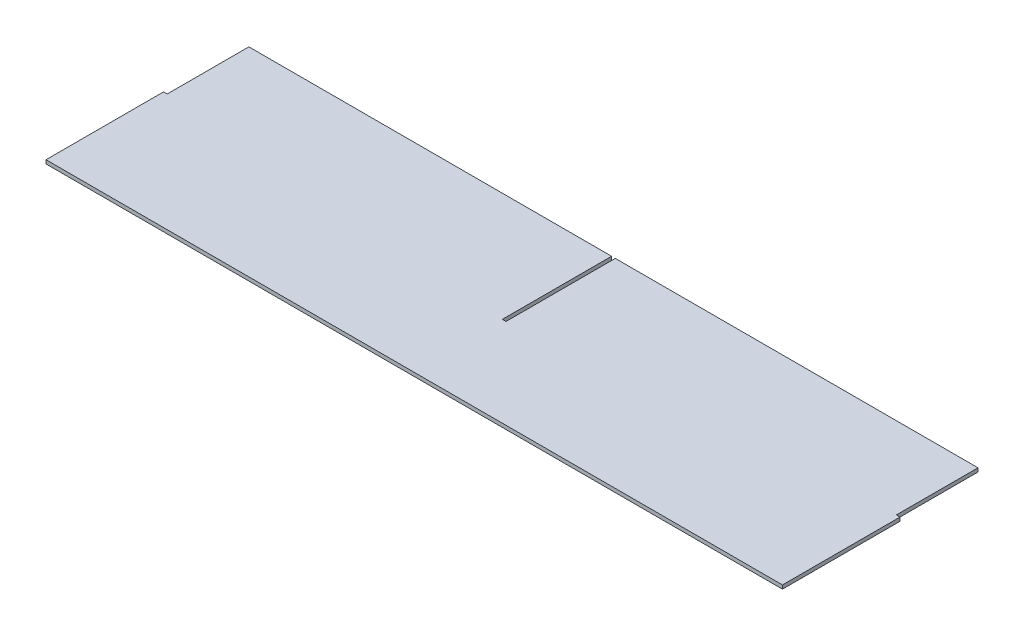
ISO-10303-21;
HEADER;
FILE_DESCRIPTION(('STEP AP214'),'2;1');
FILE_NAME('part.step','',(''),(''),'','','');
FILE_SCHEMA(('AUTOMOTIVE_DESIGN { 1 0 10303 214 1 1 1 1 }'));
ENDSEC;
DATA;
#1=APPLICATION_CONTEXT('core data for automotive mechanical design processes');
#2=APPLICATION_PROTOCOL_DEFINITION('international standard','automotive_design',2000,#1);
#3=PRODUCT_CONTEXT('',#1,'mechanical');
#4=PRODUCT('Part','Part','',(#3));
#5=PRODUCT_RELATED_PRODUCT_CATEGORY('part','',(#4));
#6=PRODUCT_DEFINITION_FORMATION('','',#4);
#7=PRODUCT_DEFINITION_CONTEXT('part definition',#1,'design');
#8=PRODUCT_DEFINITION('design','',#6,#7);
#9=PRODUCT_DEFINITION_SHAPE('','',#8);
#10=(LENGTH_UNIT() NAMED_UNIT(*) SI_UNIT(.MILLI.,.METRE.));
#11=(NAMED_UNIT(*) PLANE_ANGLE_UNIT() SI_UNIT($,.RADIAN.));
#12=(NAMED_UNIT(*) SI_UNIT($,.STERADIAN.) SOLID_ANGLE_UNIT());
#13=UNCERTAINTY_MEASURE_WITH_UNIT(LENGTH_MEASURE(1.E-05),#10,'distance_accuracy_value','');
#14=(GEOMETRIC_REPRESENTATION_CONTEXT(3) GLOBAL_UNCERTAINTY_ASSIGNED_CONTEXT((#13)) GLOBAL_UNIT_ASSIGNED_CONTEXT((#10,
#11,#12)) REPRESENTATION_CONTEXT('',''));
#15=CARTESIAN_POINT('',(0.,0.,0.));
#16=DIRECTION('',(0.,0.,1.));
#17=DIRECTION('',(1.,0.,0.));
#18=AXIS2_PLACEMENT_3D('',#15,#16,#17);
#19=CARTESIAN_POINT('',(0.,3.175,-172.09262));
#20=DIRECTION('',(0.,0.,-1.));
#21=DIRECTION('',(-1.,0.,0.));
#22=AXIS2_PLACEMENT_3D('',#19,#20,#21);
#23=PLANE('',#22);
#24=DIRECTION('',(1.,0.,0.));
#25=VECTOR('',#24,1.);
#26=CARTESIAN_POINT('',(0.,3.175,-172.09262));
#27=LINE('',#26,#25);
#28=CARTESIAN_POINT('',(319.717419999999,3.17500000000132,-172.09262));
#29=VERTEX_POINT('',#28);
#30=CARTESIAN_POINT('',(633.08484,3.175,-172.09262));
#31=VERTEX_POINT('',#30);
#32=EDGE_CURVE('E162',#29,#31,#27,.T.);
#33=ORIENTED_EDGE('',*,*,#32,.T.);
#34=DIRECTION('',(0.,-1.,0.));
#35=VECTOR('',#34,1.);
#36=CARTESIAN_POINT('',(633.08484,3.175,-172.09262));
#37=LINE('',#36,#35);
#38=CARTESIAN_POINT('',(633.08484,0.,-172.09262));
#39=VERTEX_POINT('',#38);
#40=EDGE_CURVE('E190',#31,#39,#37,.T.);
#41=ORIENTED_EDGE('',*,*,#40,.T.);
#42=DIRECTION('',(1.,0.,0.));
#43=VECTOR('',#42,1.);
#44=CARTESIAN_POINT('',(0.,0.,-172.09262));
#45=LINE('',#44,#43);
#46=CARTESIAN_POINT('',(319.717419999999,9.43689570931383E-13,-172.09262));
#47=VERTEX_POINT('',#46);
#48=EDGE_CURVE('E144',#47,#39,#45,.T.);
#49=ORIENTED_EDGE('',*,*,#48,.F.);
#50=DIRECTION('',(0.,-1.,0.));
#51=VECTOR('',#50,1.);
#52=CARTESIAN_POINT('',(319.717419999999,3.17500000000132,-172.09262));
#53=LINE('',#52,#51);
#54=EDGE_CURVE('E207',#29,#47,#53,.T.);
#55=ORIENTED_EDGE('',*,*,#54,.F.);
#56=EDGE_LOOP('',(#33,#41,#49,#55));
#57=FACE_BOUND('',#56,.T.);
#58=ADVANCED_FACE('F36',(#57),#23,.T.);
#59=CARTESIAN_POINT('',(636.25984,3.175,0.));
#60=DIRECTION('',(-1.,0.,0.));
#61=DIRECTION('',(0.,0.,1.));
#62=AXIS2_PLACEMENT_3D('',#59,#60,#61);
#63=PLANE('',#62);
#64=DIRECTION('',(0.,1.,0.));
#65=VECTOR('',#64,1.);
#66=CARTESIAN_POINT('',(636.25984,3.175,-101.6));
#67=LINE('',#66,#65);
#68=CARTESIAN_POINT('',(636.25984,0.,-101.6));
#69=VERTEX_POINT('',#68);
#70=CARTESIAN_POINT('',(636.25984,3.175,-101.6));
#71=VERTEX_POINT('',#70);
#72=EDGE_CURVE('E59',#69,#71,#67,.T.);
#73=ORIENTED_EDGE('',*,*,#72,.T.);
#74=DIRECTION('',(0.,0.,-1.));
#75=VECTOR('',#74,1.);
#76=CARTESIAN_POINT('',(636.25984,3.175,0.));
#77=LINE('',#76,#75);
#78=CARTESIAN_POINT('',(636.25984,3.175,0.));
#79=VERTEX_POINT('',#78);
#80=EDGE_CURVE('E170',#79,#71,#77,.T.);
#81=ORIENTED_EDGE('',*,*,#80,.F.);
#82=DIRECTION('',(0.,-1.,0.));
#83=VECTOR('',#82,1.);
#84=CARTESIAN_POINT('',(636.25984,3.175,0.));
#85=LINE('',#84,#83);
#86=CARTESIAN_POINT('',(636.25984,0.,0.));
#87=VERTEX_POINT('',#86);
#88=EDGE_CURVE('E40',#79,#87,#85,.T.);
#89=ORIENTED_EDGE('',*,*,#88,.T.);
#90=DIRECTION('',(0.,0.,-1.));
#91=VECTOR('',#90,1.);
#92=CARTESIAN_POINT('',(636.25984,0.,0.));
#93=LINE('',#92,#91);
#94=EDGE_CURVE('E156',#87,#69,#93,.T.);
#95=ORIENTED_EDGE('',*,*,#94,.T.);
#96=EDGE_LOOP('',(#73,#81,#89,#95));
#97=FACE_BOUND('',#96,.T.);
#98=ADVANCED_FACE('F177',(#97),#63,.F.);
#99=CARTESIAN_POINT('',(3.175,0.,-172.09262));
#100=VERTEX_POINT('',#99);
#101=CARTESIAN_POINT('',(316.542419999999,9.43689570931383E-13,-172.09262));
#102=VERTEX_POINT('',#101);
#103=EDGE_CURVE('E148',#100,#102,#45,.T.);
#104=ORIENTED_EDGE('',*,*,#103,.F.);
#105=DIRECTION('',(0.,1.,0.));
#106=VECTOR('',#105,1.);
#107=CARTESIAN_POINT('',(3.175,3.175,-172.09262));
#108=LINE('',#107,#106);
#109=CARTESIAN_POINT('',(3.175,3.175,-172.09262));
#110=VERTEX_POINT('',#109);
#111=EDGE_CURVE('E138',#100,#110,#108,.T.);
#112=ORIENTED_EDGE('',*,*,#111,.T.);
#113=CARTESIAN_POINT('',(316.542419999999,3.17500000000237,-172.09262));
#114=VERTEX_POINT('',#113);
#115=EDGE_CURVE('E165',#110,#114,#27,.T.);
#116=ORIENTED_EDGE('',*,*,#115,.T.);
#117=DIRECTION('',(0.,1.,0.));
#118=VECTOR('',#117,1.);
#119=CARTESIAN_POINT('',(316.542419999999,3.17500000000237,-172.09262));
#120=LINE('',#119,#118);
#121=EDGE_CURVE('E198',#102,#114,#120,.T.);
#122=ORIENTED_EDGE('',*,*,#121,.F.);
#123=EDGE_LOOP('',(#104,#112,#116,#122));
#124=FACE_BOUND('',#123,.T.);
#125=ADVANCED_FACE('F246',(#124),#23,.T.);
#126=CARTESIAN_POINT('',(0.,3.175,0.));
#127=DIRECTION('',(0.,-1.,0.));
#128=DIRECTION('',(0.,0.,-1.));
#129=AXIS2_PLACEMENT_3D('',#126,#127,#128);
#130=PLANE('',#129);
#131=DIRECTION('',(0.,0.,-1.));
#132=VECTOR('',#131,1.);
#133=CARTESIAN_POINT('',(3.175,3.175,-101.6));
#134=LINE('',#133,#132);
#135=CARTESIAN_POINT('',(3.175,3.175,-101.6));
#136=VERTEX_POINT('',#135);
#137=EDGE_CURVE('E234',#136,#110,#134,.T.);
#138=ORIENTED_EDGE('',*,*,#137,.F.);
#139=DIRECTION('',(-1.,0.,0.));
#140=VECTOR('',#139,1.);
#141=CARTESIAN_POINT('',(0.,3.175,-101.6));
#142=LINE('',#141,#140);
#143=CARTESIAN_POINT('',(0.,3.175,-101.6));
#144=VERTEX_POINT('',#143);
#145=EDGE_CURVE('E236',#136,#144,#142,.T.);
#146=ORIENTED_EDGE('',*,*,#145,.T.);
#147=DIRECTION('',(0.,0.,-1.));
#148=VECTOR('',#147,1.);
#149=CARTESIAN_POINT('',(0.,3.175,0.));
#150=LINE('',#149,#148);
#151=CARTESIAN_POINT('',(0.,3.175,0.));
#152=VERTEX_POINT('',#151);
#153=EDGE_CURVE('E137',#152,#144,#150,.T.);
#154=ORIENTED_EDGE('',*,*,#153,.F.);
#155=DIRECTION('',(1.,0.,0.));
#156=VECTOR('',#155,1.);
#157=CARTESIAN_POINT('',(0.,3.175,0.));
#158=LINE('',#157,#156);
#159=EDGE_CURVE('E153',#152,#79,#158,.T.);
#160=ORIENTED_EDGE('',*,*,#159,.T.);
#161=ORIENTED_EDGE('',*,*,#80,.T.);
#162=DIRECTION('',(-1.,0.,0.));
#163=VECTOR('',#162,1.);
#164=CARTESIAN_POINT('',(636.25984,3.175,-101.6));
#165=LINE('',#164,#163);
#166=CARTESIAN_POINT('',(633.08484,3.175,-101.6));
#167=VERTEX_POINT('',#166);
#168=EDGE_CURVE('E186',#71,#167,#165,.T.);
#169=ORIENTED_EDGE('',*,*,#168,.T.);
#170=DIRECTION('',(0.,0.,-1.));
#171=VECTOR('',#170,1.);
#172=CARTESIAN_POINT('',(633.08484,3.175,-101.6));
#173=LINE('',#172,#171);
#174=EDGE_CURVE('E184',#167,#31,#173,.T.);
#175=ORIENTED_EDGE('',*,*,#174,.T.);
#176=ORIENTED_EDGE('',*,*,#32,.F.);
#177=DIRECTION('',(0.,0.,-1.));
#178=VECTOR('',#177,1.);
#179=CARTESIAN_POINT('',(319.717419999999,3.17500000000132,-77.72654));
#180=LINE('',#179,#178);
#181=CARTESIAN_POINT('',(319.717419999999,3.17500000000132,-77.72654));
#182=VERTEX_POINT('',#181);
#183=EDGE_CURVE('E145',#182,#29,#180,.T.);
#184=ORIENTED_EDGE('',*,*,#183,.F.);
#185=DIRECTION('',(1.,-3.32192716029536E-13,0.));
#186=VECTOR('',#185,1.);
#187=CARTESIAN_POINT('',(319.717419999999,3.17500000000132,-77.72654));
#188=LINE('',#187,#186);
#189=CARTESIAN_POINT('',(316.542419999999,3.17500000000237,-77.72654));
#190=VERTEX_POINT('',#189);
#191=EDGE_CURVE('E204',#190,#182,#188,.T.);
#192=ORIENTED_EDGE('',*,*,#191,.F.);
#193=DIRECTION('',(0.,0.,-1.));
#194=VECTOR('',#193,1.);
#195=CARTESIAN_POINT('',(316.542419999999,3.17500000000237,-77.72654));
#196=LINE('',#195,#194);
#197=EDGE_CURVE('E150',#190,#114,#196,.T.);
#198=ORIENTED_EDGE('',*,*,#197,.T.);
#199=ORIENTED_EDGE('',*,*,#115,.F.);
#200=EDGE_LOOP('',(#138,#146,#154,#160,#161,#169,#175,#176,#184,#192,#198,#199));
#201=FACE_BOUND('',#200,.T.);
#202=ADVANCED_FACE('F229',(#201),#130,.F.);
#203=CARTESIAN_POINT('',(0.,0.,0.));
#204=DIRECTION('',(0.,-1.,0.));
#205=DIRECTION('',(0.,0.,-1.));
#206=AXIS2_PLACEMENT_3D('',#203,#204,#205);
#207=PLANE('',#206);
#208=DIRECTION('',(1.,0.,0.));
#209=VECTOR('',#208,1.);
#210=CARTESIAN_POINT('',(0.,0.,-101.6));
#211=LINE('',#210,#209);
#212=CARTESIAN_POINT('',(0.,0.,-101.6));
#213=VERTEX_POINT('',#212);
#214=CARTESIAN_POINT('',(3.175,0.,-101.6));
#215=VERTEX_POINT('',#214);
#216=EDGE_CURVE('E123',#213,#215,#211,.T.);
#217=ORIENTED_EDGE('',*,*,#216,.T.);
#218=DIRECTION('',(0.,0.,-1.));
#219=VECTOR('',#218,1.);
#220=CARTESIAN_POINT('',(3.175,0.,-101.6));
#221=LINE('',#220,#219);
#222=EDGE_CURVE('E209',#215,#100,#221,.T.);
#223=ORIENTED_EDGE('',*,*,#222,.T.);
#224=ORIENTED_EDGE('',*,*,#103,.T.);
#225=DIRECTION('',(0.,0.,-1.));
#226=VECTOR('',#225,1.);
#227=CARTESIAN_POINT('',(316.542419999999,9.43689570931383E-13,-77.72654));
#228=LINE('',#227,#226);
#229=CARTESIAN_POINT('',(316.542419999999,9.43689570931383E-13,-77.72654));
#230=VERTEX_POINT('',#229);
#231=EDGE_CURVE('E213',#230,#102,#228,.T.);
#232=ORIENTED_EDGE('',*,*,#231,.F.);
#233=DIRECTION('',(-1.,0.,0.));
#234=VECTOR('',#233,1.);
#235=CARTESIAN_POINT('',(319.717419999999,9.43689570931383E-13,-77.72654));
#236=LINE('',#235,#234);
#237=CARTESIAN_POINT('',(319.717419999999,0.,-77.72654));
#238=VERTEX_POINT('',#237);
#239=EDGE_CURVE('E197',#238,#230,#236,.T.);
#240=ORIENTED_EDGE('',*,*,#239,.F.);
#241=DIRECTION('',(0.,0.,-1.));
#242=VECTOR('',#241,1.);
#243=CARTESIAN_POINT('',(319.717419999999,9.43689570931383E-13,-77.72654));
#244=LINE('',#243,#242);
#245=EDGE_CURVE('E168',#238,#47,#244,.T.);
#246=ORIENTED_EDGE('',*,*,#245,.T.);
#247=ORIENTED_EDGE('',*,*,#48,.T.);
#248=DIRECTION('',(0.,0.,-1.));
#249=VECTOR('',#248,1.);
#250=CARTESIAN_POINT('',(633.08484,0.,-101.6));
#251=LINE('',#250,#249);
#252=CARTESIAN_POINT('',(633.08484,0.,-101.6));
#253=VERTEX_POINT('',#252);
#254=EDGE_CURVE('E180',#253,#39,#251,.T.);
#255=ORIENTED_EDGE('',*,*,#254,.F.);
#256=DIRECTION('',(1.,0.,0.));
#257=VECTOR('',#256,1.);
#258=CARTESIAN_POINT('',(636.25984,0.,-101.6));
#259=LINE('',#258,#257);
#260=EDGE_CURVE('E179',#253,#69,#259,.T.);
#261=ORIENTED_EDGE('',*,*,#260,.T.);
#262=ORIENTED_EDGE('',*,*,#94,.F.);
#263=DIRECTION('',(1.,0.,0.));
#264=VECTOR('',#263,1.);
#265=CARTESIAN_POINT('',(0.,0.,0.));
#266=LINE('',#265,#264);
#267=CARTESIAN_POINT('',(0.,0.,0.));
#268=VERTEX_POINT('',#267);
#269=EDGE_CURVE('E143',#268,#87,#266,.T.);
#270=ORIENTED_EDGE('',*,*,#269,.F.);
#271=DIRECTION('',(0.,0.,-1.));
#272=VECTOR('',#271,1.);
#273=CARTESIAN_POINT('',(0.,0.,0.));
#274=LINE('',#273,#272);
#275=EDGE_CURVE('E135',#268,#213,#274,.T.);
#276=ORIENTED_EDGE('',*,*,#275,.T.);
#277=EDGE_LOOP('',(#217,#223,#224,#232,#240,#246,#247,#255,#261,#262,#270,#276));
#278=FACE_BOUND('',#277,.T.);
#279=ADVANCED_FACE('F141',(#278),#207,.T.);
#280=CARTESIAN_POINT('',(0.,3.175,0.));
#281=DIRECTION('',(-1.,0.,0.));
#282=DIRECTION('',(0.,0.,1.));
#283=AXIS2_PLACEMENT_3D('',#280,#281,#282);
#284=PLANE('',#283);
#285=DIRECTION('',(0.,-1.,0.));
#286=VECTOR('',#285,1.);
#287=CARTESIAN_POINT('',(0.,3.175,-101.6));
#288=LINE('',#287,#286);
#289=EDGE_CURVE('E126',#144,#213,#288,.T.);
#290=ORIENTED_EDGE('',*,*,#289,.T.);
#291=ORIENTED_EDGE('',*,*,#275,.F.);
#292=DIRECTION('',(0.,-1.,0.));
#293=VECTOR('',#292,1.);
#294=CARTESIAN_POINT('',(0.,3.175,0.));
#295=LINE('',#294,#293);
#296=EDGE_CURVE('E11',#152,#268,#295,.T.);
#297=ORIENTED_EDGE('',*,*,#296,.F.);
#298=ORIENTED_EDGE('',*,*,#153,.T.);
#299=EDGE_LOOP('',(#290,#291,#297,#298));
#300=FACE_BOUND('',#299,.T.);
#301=ADVANCED_FACE('F38',(#300),#284,.T.);
#302=CARTESIAN_POINT('',(0.,3.175,0.));
#303=DIRECTION('',(0.,0.,-1.));
#304=DIRECTION('',(-1.,0.,0.));
#305=AXIS2_PLACEMENT_3D('',#302,#303,#304);
#306=PLANE('',#305);
#307=ORIENTED_EDGE('',*,*,#269,.T.);
#308=ORIENTED_EDGE('',*,*,#88,.F.);
#309=ORIENTED_EDGE('',*,*,#159,.F.);
#310=ORIENTED_EDGE('',*,*,#296,.T.);
#311=EDGE_LOOP('',(#307,#308,#309,#310));
#312=FACE_BOUND('',#311,.T.);
#313=ADVANCED_FACE('F252',(#312),#306,.F.);
#314=CARTESIAN_POINT('',(319.717419999999,3.17500000000132,-77.72654));
#315=DIRECTION('',(1.,0.,0.));
#316=DIRECTION('',(0.,0.,-1.));
#317=AXIS2_PLACEMENT_3D('',#314,#315,#316);
#318=PLANE('',#317);
#319=ORIENTED_EDGE('',*,*,#54,.T.);
#320=ORIENTED_EDGE('',*,*,#245,.F.);
#321=DIRECTION('',(0.,-1.,0.));
#322=VECTOR('',#321,1.);
#323=CARTESIAN_POINT('',(319.717419999999,3.17500000000132,-77.72654));
#324=LINE('',#323,#322);
#325=EDGE_CURVE('E195',#182,#238,#324,.T.);
#326=ORIENTED_EDGE('',*,*,#325,.F.);
#327=ORIENTED_EDGE('',*,*,#183,.T.);
#328=EDGE_LOOP('',(#319,#320,#326,#327));
#329=FACE_BOUND('',#328,.T.);
#330=ADVANCED_FACE('F250',(#329),#318,.F.);
#331=CARTESIAN_POINT('',(316.542419999999,3.17500000000237,-77.72654));
#332=DIRECTION('',(-1.,0.,0.));
#333=DIRECTION('',(0.,0.,1.));
#334=AXIS2_PLACEMENT_3D('',#331,#332,#333);
#335=PLANE('',#334);
#336=ORIENTED_EDGE('',*,*,#121,.T.);
#337=ORIENTED_EDGE('',*,*,#197,.F.);
#338=DIRECTION('',(0.,1.,0.));
#339=VECTOR('',#338,1.);
#340=CARTESIAN_POINT('',(316.542419999999,3.17500000000237,-77.72654));
#341=LINE('',#340,#339);
#342=EDGE_CURVE('E201',#230,#190,#341,.T.);
#343=ORIENTED_EDGE('',*,*,#342,.F.);
#344=ORIENTED_EDGE('',*,*,#231,.T.);
#345=EDGE_LOOP('',(#336,#337,#343,#344));
#346=FACE_BOUND('',#345,.T.);
#347=ADVANCED_FACE('F247',(#346),#335,.F.);
#348=CARTESIAN_POINT('',(0.,0.,-77.72654));
#349=DIRECTION('',(0.,0.,-1.));
#350=DIRECTION('',(-1.,0.,0.));
#351=AXIS2_PLACEMENT_3D('',#348,#349,#350);
#352=PLANE('',#351);
#353=ORIENTED_EDGE('',*,*,#325,.T.);
#354=ORIENTED_EDGE('',*,*,#239,.T.);
#355=ORIENTED_EDGE('',*,*,#342,.T.);
#356=ORIENTED_EDGE('',*,*,#191,.T.);
#357=EDGE_LOOP('',(#353,#354,#355,#356));
#358=FACE_BOUND('',#357,.T.);
#359=ADVANCED_FACE('F249',(#358),#352,.T.);
#360=CARTESIAN_POINT('',(633.08484,3.175,-101.6));
#361=DIRECTION('',(1.,0.,0.));
#362=DIRECTION('',(0.,0.,-1.));
#363=AXIS2_PLACEMENT_3D('',#360,#361,#362);
#364=PLANE('',#363);
#365=ORIENTED_EDGE('',*,*,#40,.F.);
#366=ORIENTED_EDGE('',*,*,#174,.F.);
#367=DIRECTION('',(0.,-1.,0.));
#368=VECTOR('',#367,1.);
#369=CARTESIAN_POINT('',(633.08484,3.175,-101.6));
#370=LINE('',#369,#368);
#371=EDGE_CURVE('E182',#167,#253,#370,.T.);
#372=ORIENTED_EDGE('',*,*,#371,.T.);
#373=ORIENTED_EDGE('',*,*,#254,.T.);
#374=EDGE_LOOP('',(#365,#366,#372,#373));
#375=FACE_BOUND('',#374,.T.);
#376=ADVANCED_FACE('F227',(#375),#364,.T.);
#377=CARTESIAN_POINT('',(0.,0.,-101.6));
#378=DIRECTION('',(0.,0.,-1.));
#379=DIRECTION('',(-1.,0.,0.));
#380=AXIS2_PLACEMENT_3D('',#377,#378,#379);
#381=PLANE('',#380);
#382=ORIENTED_EDGE('',*,*,#72,.F.);
#383=ORIENTED_EDGE('',*,*,#260,.F.);
#384=ORIENTED_EDGE('',*,*,#371,.F.);
#385=ORIENTED_EDGE('',*,*,#168,.F.);
#386=EDGE_LOOP('',(#382,#383,#384,#385));
#387=FACE_BOUND('',#386,.T.);
#388=ADVANCED_FACE('F333',(#387),#381,.T.);
#389=CARTESIAN_POINT('',(3.175,3.175,-101.6));
#390=DIRECTION('',(-1.,0.,0.));
#391=DIRECTION('',(0.,-1.,0.));
#392=AXIS2_PLACEMENT_3D('',#389,#390,#391);
#393=PLANE('',#392);
#394=ORIENTED_EDGE('',*,*,#111,.F.);
#395=ORIENTED_EDGE('',*,*,#222,.F.);
#396=DIRECTION('',(0.,1.,0.));
#397=VECTOR('',#396,1.);
#398=CARTESIAN_POINT('',(3.175,3.175,-101.6));
#399=LINE('',#398,#397);
#400=EDGE_CURVE('E51',#215,#136,#399,.T.);
#401=ORIENTED_EDGE('',*,*,#400,.T.);
#402=ORIENTED_EDGE('',*,*,#137,.T.);
#403=EDGE_LOOP('',(#394,#395,#401,#402));
#404=FACE_BOUND('',#403,.T.);
#405=ADVANCED_FACE('F241',(#404),#393,.T.);
#406=CARTESIAN_POINT('',(0.,0.,-101.6));
#407=DIRECTION('',(0.,0.,1.));
#408=DIRECTION('',(1.,0.,0.));
#409=AXIS2_PLACEMENT_3D('',#406,#407,#408);
#410=PLANE('',#409);
#411=ORIENTED_EDGE('',*,*,#289,.F.);
#412=ORIENTED_EDGE('',*,*,#145,.F.);
#413=ORIENTED_EDGE('',*,*,#400,.F.);
#414=ORIENTED_EDGE('',*,*,#216,.F.);
#415=EDGE_LOOP('',(#411,#412,#413,#414));
#416=FACE_BOUND('',#415,.T.);
#417=ADVANCED_FACE('F125',(#416),#410,.F.);
#418=CLOSED_SHELL('',(#58,#98,#125,#202,#279,#301,#313,#330,#347,#359,#376,#388,#405,#417));
#419=MANIFOLD_SOLID_BREP('B2',#418);
#420=ADVANCED_BREP_SHAPE_REPRESENTATION('',(#18,#419),#14);
#421=SHAPE_DEFINITION_REPRESENTATION(#9,#420);
ENDSEC;
END-ISO-10303-21;
